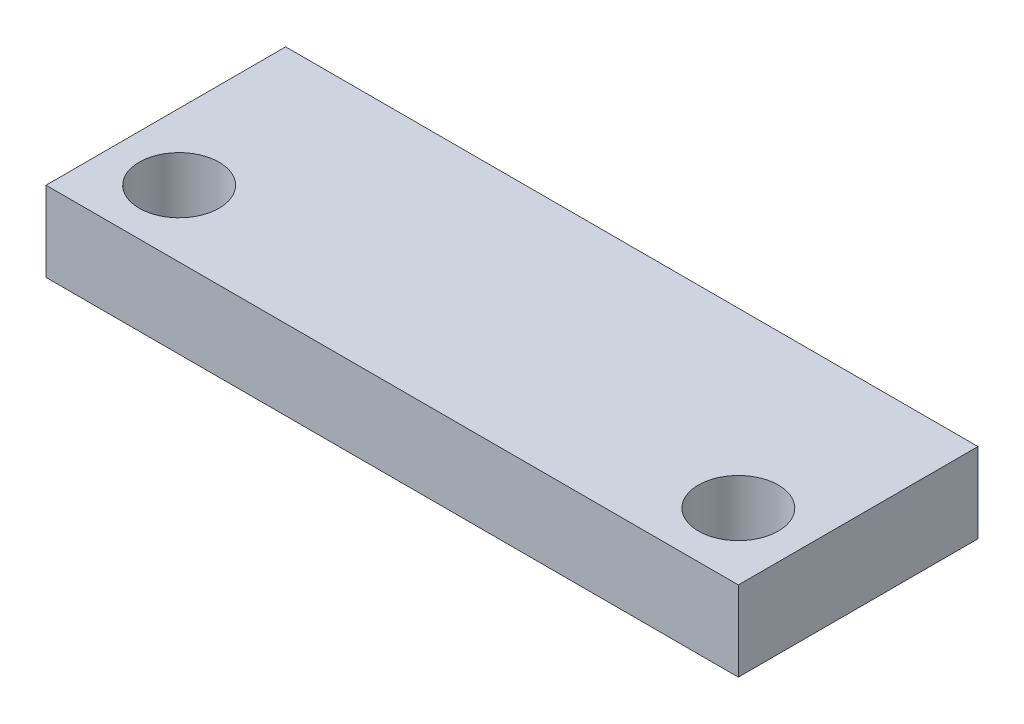
ISO-10303-21;
HEADER;
FILE_DESCRIPTION(('STEP AP214'),'2;1');
FILE_NAME('part.step','',(''),(''),'','','');
FILE_SCHEMA(('AUTOMOTIVE_DESIGN { 1 0 10303 214 1 1 1 1 }'));
ENDSEC;
DATA;
#1=APPLICATION_CONTEXT('core data for automotive mechanical design processes');
#2=APPLICATION_PROTOCOL_DEFINITION('international standard','automotive_design',2000,#1);
#3=PRODUCT_CONTEXT('',#1,'mechanical');
#4=PRODUCT('Part','Part','',(#3));
#5=PRODUCT_RELATED_PRODUCT_CATEGORY('part','',(#4));
#6=PRODUCT_DEFINITION_FORMATION('','',#4);
#7=PRODUCT_DEFINITION_CONTEXT('part definition',#1,'design');
#8=PRODUCT_DEFINITION('design','',#6,#7);
#9=PRODUCT_DEFINITION_SHAPE('','',#8);
#10=(LENGTH_UNIT() NAMED_UNIT(*) SI_UNIT(.MILLI.,.METRE.));
#11=(NAMED_UNIT(*) PLANE_ANGLE_UNIT() SI_UNIT($,.RADIAN.));
#12=(NAMED_UNIT(*) SI_UNIT($,.STERADIAN.) SOLID_ANGLE_UNIT());
#13=UNCERTAINTY_MEASURE_WITH_UNIT(LENGTH_MEASURE(1.E-05),#10,'distance_accuracy_value','');
#14=(GEOMETRIC_REPRESENTATION_CONTEXT(3) GLOBAL_UNCERTAINTY_ASSIGNED_CONTEXT((#13)) GLOBAL_UNIT_ASSIGNED_CONTEXT((#10,
#11,#12)) REPRESENTATION_CONTEXT('',''));
#15=CARTESIAN_POINT('',(0.,0.,0.));
#16=DIRECTION('',(0.,0.,1.));
#17=DIRECTION('',(1.,0.,0.));
#18=AXIS2_PLACEMENT_3D('',#15,#16,#17);
#19=CARTESIAN_POINT('',(0.,3.,0.));
#20=DIRECTION('',(0.,-1.,0.));
#21=DIRECTION('',(0.,0.,-1.));
#22=AXIS2_PLACEMENT_3D('',#19,#20,#21);
#23=PLANE('',#22);
#24=DIRECTION('',(0.,0.,1.));
#25=VECTOR('',#24,1.);
#26=CARTESIAN_POINT('',(0.,3.,0.));
#27=LINE('',#26,#25);
#28=CARTESIAN_POINT('',(0.,3.,-9.));
#29=VERTEX_POINT('',#28);
#30=CARTESIAN_POINT('',(0.,3.,0.));
#31=VERTEX_POINT('',#30);
#32=EDGE_CURVE('E96',#29,#31,#27,.T.);
#33=ORIENTED_EDGE('',*,*,#32,.T.);
#34=DIRECTION('',(1.,0.,0.));
#35=VECTOR('',#34,1.);
#36=CARTESIAN_POINT('',(0.,3.,0.));
#37=LINE('',#36,#35);
#38=CARTESIAN_POINT('',(26.,3.,0.));
#39=VERTEX_POINT('',#38);
#40=EDGE_CURVE('E91',#31,#39,#37,.T.);
#41=ORIENTED_EDGE('',*,*,#40,.T.);
#42=DIRECTION('',(0.,0.,-1.));
#43=VECTOR('',#42,1.);
#44=CARTESIAN_POINT('',(26.,3.,0.));
#45=LINE('',#44,#43);
#46=CARTESIAN_POINT('',(26.,3.,-9.));
#47=VERTEX_POINT('',#46);
#48=EDGE_CURVE('E94',#39,#47,#45,.T.);
#49=ORIENTED_EDGE('',*,*,#48,.T.);
#50=DIRECTION('',(-1.,0.,0.));
#51=VECTOR('',#50,1.);
#52=CARTESIAN_POINT('',(0.,3.,-9.));
#53=LINE('',#52,#51);
#54=EDGE_CURVE('E61',#47,#29,#53,.T.);
#55=ORIENTED_EDGE('',*,*,#54,.T.);
#56=EDGE_LOOP('',(#33,#41,#49,#55));
#57=FACE_BOUND('',#56,.T.);
#58=CARTESIAN_POINT('',(23.5,3.,-2.5));
#59=DIRECTION('',(0.,1.,0.));
#60=DIRECTION('',(0.,0.,-1.));
#61=AXIS2_PLACEMENT_3D('',#58,#59,#60);
#62=CIRCLE('',#61,1.5);
#63=CARTESIAN_POINT('',(23.5,3.,-4.));
#64=VERTEX_POINT('',#63);
#65=EDGE_CURVE('E116',#64,#64,#62,.T.);
#66=ORIENTED_EDGE('',*,*,#65,.F.);
#67=EDGE_LOOP('',(#66));
#68=FACE_BOUND('',#67,.T.);
#69=CARTESIAN_POINT('',(2.5,3.,-2.5));
#70=DIRECTION('',(0.,1.,0.));
#71=DIRECTION('',(0.,0.,1.));
#72=AXIS2_PLACEMENT_3D('',#69,#70,#71);
#73=CIRCLE('',#72,1.5);
#74=CARTESIAN_POINT('',(2.5,3.,-1.));
#75=VERTEX_POINT('',#74);
#76=EDGE_CURVE('E138',#75,#75,#73,.T.);
#77=ORIENTED_EDGE('',*,*,#76,.F.);
#78=EDGE_LOOP('',(#77));
#79=FACE_BOUND('',#78,.T.);
#80=ADVANCED_FACE('F43',(#57,#68,#79),#23,.F.);
#81=CARTESIAN_POINT('',(0.,0.,0.));
#82=DIRECTION('',(0.,-1.,0.));
#83=DIRECTION('',(0.,0.,-1.));
#84=AXIS2_PLACEMENT_3D('',#81,#82,#83);
#85=PLANE('',#84);
#86=CARTESIAN_POINT('',(23.5,0.,-2.5));
#87=DIRECTION('',(0.,1.,0.));
#88=DIRECTION('',(0.,0.,-1.));
#89=AXIS2_PLACEMENT_3D('',#86,#87,#88);
#90=CIRCLE('',#89,1.5);
#91=CARTESIAN_POINT('',(23.5,0.,-4.));
#92=VERTEX_POINT('',#91);
#93=EDGE_CURVE('E134',#92,#92,#90,.T.);
#94=ORIENTED_EDGE('',*,*,#93,.T.);
#95=EDGE_LOOP('',(#94));
#96=FACE_BOUND('',#95,.T.);
#97=DIRECTION('',(0.,0.,1.));
#98=VECTOR('',#97,1.);
#99=CARTESIAN_POINT('',(0.,0.,0.));
#100=LINE('',#99,#98);
#101=CARTESIAN_POINT('',(0.,0.,-9.));
#102=VERTEX_POINT('',#101);
#103=CARTESIAN_POINT('',(0.,0.,0.));
#104=VERTEX_POINT('',#103);
#105=EDGE_CURVE('E112',#102,#104,#100,.T.);
#106=ORIENTED_EDGE('',*,*,#105,.F.);
#107=DIRECTION('',(-1.,0.,0.));
#108=VECTOR('',#107,1.);
#109=CARTESIAN_POINT('',(0.,0.,-9.));
#110=LINE('',#109,#108);
#111=CARTESIAN_POINT('',(26.,0.,-9.));
#112=VERTEX_POINT('',#111);
#113=EDGE_CURVE('E84',#112,#102,#110,.T.);
#114=ORIENTED_EDGE('',*,*,#113,.F.);
#115=DIRECTION('',(0.,0.,-1.));
#116=VECTOR('',#115,1.);
#117=CARTESIAN_POINT('',(26.,0.,0.));
#118=LINE('',#117,#116);
#119=CARTESIAN_POINT('',(26.,0.,0.));
#120=VERTEX_POINT('',#119);
#121=EDGE_CURVE('E78',#120,#112,#118,.T.);
#122=ORIENTED_EDGE('',*,*,#121,.F.);
#123=DIRECTION('',(1.,0.,0.));
#124=VECTOR('',#123,1.);
#125=CARTESIAN_POINT('',(0.,0.,0.));
#126=LINE('',#125,#124);
#127=EDGE_CURVE('E101',#104,#120,#126,.T.);
#128=ORIENTED_EDGE('',*,*,#127,.F.);
#129=EDGE_LOOP('',(#106,#114,#122,#128));
#130=FACE_BOUND('',#129,.T.);
#131=CARTESIAN_POINT('',(2.5,0.,-2.5));
#132=DIRECTION('',(0.,1.,0.));
#133=DIRECTION('',(0.,0.,1.));
#134=AXIS2_PLACEMENT_3D('',#131,#132,#133);
#135=CIRCLE('',#134,1.5);
#136=CARTESIAN_POINT('',(2.5,0.,-1.));
#137=VERTEX_POINT('',#136);
#138=EDGE_CURVE('E142',#137,#137,#135,.T.);
#139=ORIENTED_EDGE('',*,*,#138,.T.);
#140=EDGE_LOOP('',(#139));
#141=FACE_BOUND('',#140,.T.);
#142=ADVANCED_FACE('F129',(#96,#130,#141),#85,.T.);
#143=CARTESIAN_POINT('',(0.,3.,0.));
#144=DIRECTION('',(1.,0.,0.));
#145=DIRECTION('',(0.,0.,-1.));
#146=AXIS2_PLACEMENT_3D('',#143,#144,#145);
#147=PLANE('',#146);
#148=ORIENTED_EDGE('',*,*,#105,.T.);
#149=DIRECTION('',(0.,-1.,0.));
#150=VECTOR('',#149,1.);
#151=CARTESIAN_POINT('',(0.,3.,0.));
#152=LINE('',#151,#150);
#153=EDGE_CURVE('E11',#31,#104,#152,.T.);
#154=ORIENTED_EDGE('',*,*,#153,.F.);
#155=ORIENTED_EDGE('',*,*,#32,.F.);
#156=DIRECTION('',(0.,-1.,0.));
#157=VECTOR('',#156,1.);
#158=CARTESIAN_POINT('',(0.,3.,-9.));
#159=LINE('',#158,#157);
#160=EDGE_CURVE('E108',#29,#102,#159,.T.);
#161=ORIENTED_EDGE('',*,*,#160,.T.);
#162=EDGE_LOOP('',(#148,#154,#155,#161));
#163=FACE_BOUND('',#162,.T.);
#164=ADVANCED_FACE('F45',(#163),#147,.F.);
#165=CARTESIAN_POINT('',(0.,3.,0.));
#166=DIRECTION('',(0.,0.,-1.));
#167=DIRECTION('',(-1.,0.,0.));
#168=AXIS2_PLACEMENT_3D('',#165,#166,#167);
#169=PLANE('',#168);
#170=ORIENTED_EDGE('',*,*,#127,.T.);
#171=DIRECTION('',(0.,-1.,0.));
#172=VECTOR('',#171,1.);
#173=CARTESIAN_POINT('',(26.,3.,0.));
#174=LINE('',#173,#172);
#175=EDGE_CURVE('E53',#39,#120,#174,.T.);
#176=ORIENTED_EDGE('',*,*,#175,.F.);
#177=ORIENTED_EDGE('',*,*,#40,.F.);
#178=ORIENTED_EDGE('',*,*,#153,.T.);
#179=EDGE_LOOP('',(#170,#176,#177,#178));
#180=FACE_BOUND('',#179,.T.);
#181=ADVANCED_FACE('F100',(#180),#169,.F.);
#182=CARTESIAN_POINT('',(26.,3.,0.));
#183=DIRECTION('',(-1.,0.,0.));
#184=DIRECTION('',(0.,0.,1.));
#185=AXIS2_PLACEMENT_3D('',#182,#183,#184);
#186=PLANE('',#185);
#187=ORIENTED_EDGE('',*,*,#121,.T.);
#188=DIRECTION('',(0.,-1.,0.));
#189=VECTOR('',#188,1.);
#190=CARTESIAN_POINT('',(26.,3.,-9.));
#191=LINE('',#190,#189);
#192=EDGE_CURVE('E103',#47,#112,#191,.T.);
#193=ORIENTED_EDGE('',*,*,#192,.F.);
#194=ORIENTED_EDGE('',*,*,#48,.F.);
#195=ORIENTED_EDGE('',*,*,#175,.T.);
#196=EDGE_LOOP('',(#187,#193,#194,#195));
#197=FACE_BOUND('',#196,.T.);
#198=ADVANCED_FACE('F104',(#197),#186,.F.);
#199=CARTESIAN_POINT('',(0.,3.,-9.));
#200=DIRECTION('',(0.,0.,1.));
#201=DIRECTION('',(1.,0.,0.));
#202=AXIS2_PLACEMENT_3D('',#199,#200,#201);
#203=PLANE('',#202);
#204=ORIENTED_EDGE('',*,*,#113,.T.);
#205=ORIENTED_EDGE('',*,*,#160,.F.);
#206=ORIENTED_EDGE('',*,*,#54,.F.);
#207=ORIENTED_EDGE('',*,*,#192,.T.);
#208=EDGE_LOOP('',(#204,#205,#206,#207));
#209=FACE_BOUND('',#208,.T.);
#210=ADVANCED_FACE('F126',(#209),#203,.F.);
#211=CARTESIAN_POINT('',(23.5,3.,-2.5));
#212=DIRECTION('',(0.,-1.,0.));
#213=DIRECTION('',(0.,0.,-1.));
#214=AXIS2_PLACEMENT_3D('',#211,#212,#213);
#215=CYLINDRICAL_SURFACE('',#214,1.5);
#216=ORIENTED_EDGE('',*,*,#65,.T.);
#217=EDGE_LOOP('',(#216));
#218=FACE_BOUND('',#217,.T.);
#219=ORIENTED_EDGE('',*,*,#93,.F.);
#220=EDGE_LOOP('',(#219));
#221=FACE_BOUND('',#220,.T.);
#222=ADVANCED_FACE('F161',(#218,#221),#215,.F.);
#223=CARTESIAN_POINT('',(2.5,3.,-2.5));
#224=DIRECTION('',(0.,-1.,0.));
#225=DIRECTION('',(0.,0.,-1.));
#226=AXIS2_PLACEMENT_3D('',#223,#224,#225);
#227=CYLINDRICAL_SURFACE('',#226,1.5);
#228=ORIENTED_EDGE('',*,*,#76,.T.);
#229=EDGE_LOOP('',(#228));
#230=FACE_BOUND('',#229,.T.);
#231=ORIENTED_EDGE('',*,*,#138,.F.);
#232=EDGE_LOOP('',(#231));
#233=FACE_BOUND('',#232,.T.);
#234=ADVANCED_FACE('F150',(#230,#233),#227,.F.);
#235=CLOSED_SHELL('',(#80,#142,#164,#181,#198,#210,#222,#234));
#236=MANIFOLD_SOLID_BREP('B2',#235);
#237=ADVANCED_BREP_SHAPE_REPRESENTATION('',(#18,#236),#14);
#238=SHAPE_DEFINITION_REPRESENTATION(#9,#237);
ENDSEC;
END-ISO-10303-21;
